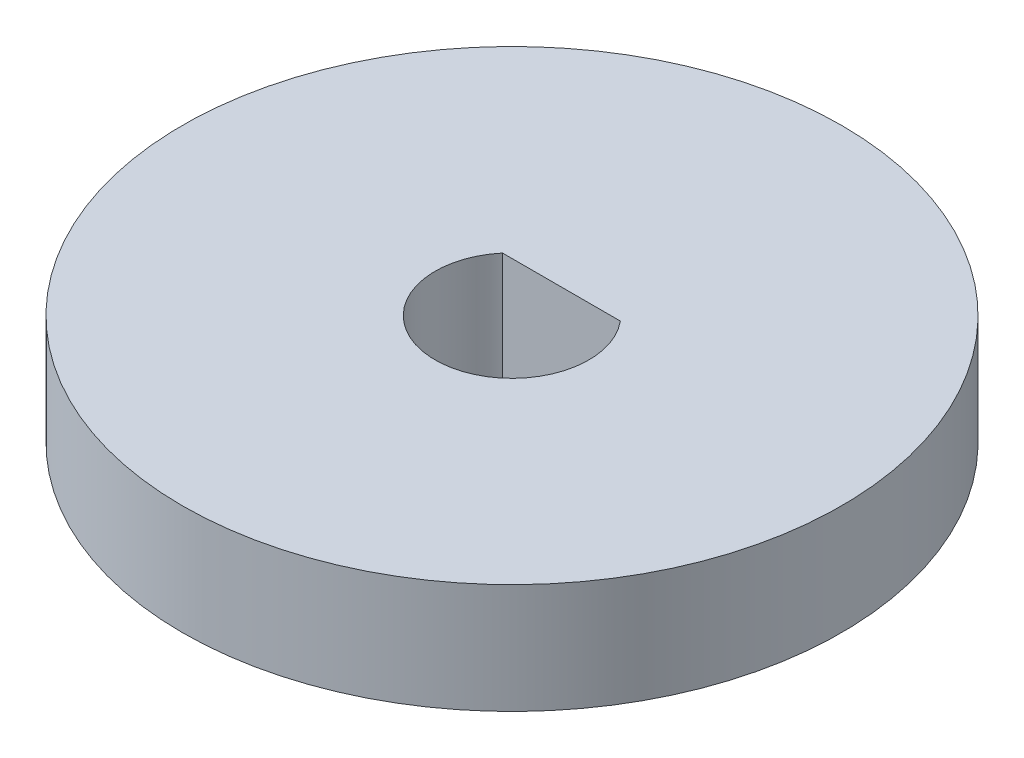
ISO-10303-21;
HEADER;
FILE_DESCRIPTION(('STEP AP214'),'2;1');
FILE_NAME('part.step','',(''),(''),'','','');
FILE_SCHEMA(('AUTOMOTIVE_DESIGN { 1 0 10303 214 1 1 1 1 }'));
ENDSEC;
DATA;
#1=APPLICATION_CONTEXT('core data for automotive mechanical design processes');
#2=APPLICATION_PROTOCOL_DEFINITION('international standard','automotive_design',2000,#1);
#3=PRODUCT_CONTEXT('',#1,'mechanical');
#4=PRODUCT('Part','Part','',(#3));
#5=PRODUCT_RELATED_PRODUCT_CATEGORY('part','',(#4));
#6=PRODUCT_DEFINITION_FORMATION('','',#4);
#7=PRODUCT_DEFINITION_CONTEXT('part definition',#1,'design');
#8=PRODUCT_DEFINITION('design','',#6,#7);
#9=PRODUCT_DEFINITION_SHAPE('','',#8);
#10=(LENGTH_UNIT() NAMED_UNIT(*) SI_UNIT(.MILLI.,.METRE.));
#11=(NAMED_UNIT(*) PLANE_ANGLE_UNIT() SI_UNIT($,.RADIAN.));
#12=(NAMED_UNIT(*) SI_UNIT($,.STERADIAN.) SOLID_ANGLE_UNIT());
#13=UNCERTAINTY_MEASURE_WITH_UNIT(LENGTH_MEASURE(1.E-05),#10,'distance_accuracy_value','');
#14=(GEOMETRIC_REPRESENTATION_CONTEXT(3) GLOBAL_UNCERTAINTY_ASSIGNED_CONTEXT((#13)) GLOBAL_UNIT_ASSIGNED_CONTEXT((#10,
#11,#12)) REPRESENTATION_CONTEXT('',''));
#15=CARTESIAN_POINT('',(0.,0.,0.));
#16=DIRECTION('',(0.,0.,1.));
#17=DIRECTION('',(1.,0.,0.));
#18=AXIS2_PLACEMENT_3D('',#15,#16,#17);
#19=CARTESIAN_POINT('',(0.,2.,0.));
#20=DIRECTION('',(0.,-1.,0.));
#21=DIRECTION('',(0.,0.,-0.999999999999997));
#22=AXIS2_PLACEMENT_3D('',#19,#20,#21);
#23=CYLINDRICAL_SURFACE('',#22,1.4);
#24=CARTESIAN_POINT('',(0.,0.,0.));
#25=DIRECTION('',(0.,1.,0.));
#26=DIRECTION('',(0.,0.,0.999999999999997));
#27=AXIS2_PLACEMENT_3D('',#24,#25,#26);
#28=CIRCLE('',#27,1.4);
#29=CARTESIAN_POINT('',(-1.07238052947637,0.,-0.899999999999999));
#30=VERTEX_POINT('',#29);
#31=CARTESIAN_POINT('',(1.07238052947635,0.,-0.900000000000001));
#32=VERTEX_POINT('',#31);
#33=EDGE_CURVE('E79',#30,#32,#28,.T.);
#34=ORIENTED_EDGE('',*,*,#33,.F.);
#35=DIRECTION('',(0.,-1.,0.));
#36=VECTOR('',#35,1.);
#37=CARTESIAN_POINT('',(-1.07238052947637,2.,-0.899999999999998));
#38=LINE('',#37,#36);
#39=CARTESIAN_POINT('',(-1.07238052947637,2.,-0.899999999999998));
#40=VERTEX_POINT('',#39);
#41=EDGE_CURVE('E13',#40,#30,#38,.T.);
#42=ORIENTED_EDGE('',*,*,#41,.F.);
#43=CARTESIAN_POINT('',(0.,2.,0.));
#44=DIRECTION('',(0.,1.,0.));
#45=DIRECTION('',(0.,0.,0.999999999999997));
#46=AXIS2_PLACEMENT_3D('',#43,#44,#45);
#47=CIRCLE('',#46,1.4);
#48=CARTESIAN_POINT('',(1.07238052947635,1.99999999999993,-0.899999999999998));
#49=VERTEX_POINT('',#48);
#50=EDGE_CURVE('E80',#40,#49,#47,.T.);
#51=ORIENTED_EDGE('',*,*,#50,.T.);
#52=DIRECTION('',(0.,-1.,0.));
#53=VECTOR('',#52,1.);
#54=CARTESIAN_POINT('',(1.07238052947635,1.99999999999993,-0.899999999999998));
#55=LINE('',#54,#53);
#56=EDGE_CURVE('E59',#49,#32,#55,.T.);
#57=ORIENTED_EDGE('',*,*,#56,.T.);
#58=EDGE_LOOP('',(#34,#42,#51,#57));
#59=FACE_BOUND('',#58,.T.);
#60=ADVANCED_FACE('F51',(#59),#23,.F.);
#61=CARTESIAN_POINT('',(0.,1.99999999999993,-0.899999999999998));
#62=DIRECTION('',(0.,0.,-0.999999999999997));
#63=DIRECTION('',(-0.999999999999997,0.,0.));
#64=AXIS2_PLACEMENT_3D('',#61,#62,#63);
#65=PLANE('',#64);
#66=DIRECTION('',(0.999999999999997,0.,0.));
#67=VECTOR('',#66,1.);
#68=CARTESIAN_POINT('',(0.,-1.04083408558608E-13,-0.900000000000001));
#69=LINE('',#68,#67);
#70=EDGE_CURVE('E82',#30,#32,#69,.T.);
#71=ORIENTED_EDGE('',*,*,#70,.T.);
#72=ORIENTED_EDGE('',*,*,#56,.F.);
#73=DIRECTION('',(0.999999999999997,0.,0.));
#74=VECTOR('',#73,1.);
#75=CARTESIAN_POINT('',(0.,1.99999999999993,-0.899999999999998));
#76=LINE('',#75,#74);
#77=EDGE_CURVE('E66',#40,#49,#76,.T.);
#78=ORIENTED_EDGE('',*,*,#77,.F.);
#79=ORIENTED_EDGE('',*,*,#41,.T.);
#80=EDGE_LOOP('',(#71,#72,#78,#79));
#81=FACE_BOUND('',#80,.T.);
#82=ADVANCED_FACE('F83',(#81),#65,.F.);
#83=CARTESIAN_POINT('',(0.,2.,0.));
#84=DIRECTION('',(0.,-1.,0.));
#85=DIRECTION('',(0.,0.,-0.999999999999997));
#86=AXIS2_PLACEMENT_3D('',#83,#84,#85);
#87=CYLINDRICAL_SURFACE('',#86,6.);
#88=CARTESIAN_POINT('',(0.,2.,0.));
#89=DIRECTION('',(0.,1.,0.));
#90=DIRECTION('',(0.,0.,0.999999999999997));
#91=AXIS2_PLACEMENT_3D('',#88,#89,#90);
#92=CIRCLE('',#91,6.);
#93=CARTESIAN_POINT('',(0.,2.,5.99999999999998));
#94=VERTEX_POINT('',#93);
#95=EDGE_CURVE('E81',#94,#94,#92,.T.);
#96=ORIENTED_EDGE('',*,*,#95,.F.);
#97=EDGE_LOOP('',(#96));
#98=FACE_BOUND('',#97,.T.);
#99=CARTESIAN_POINT('',(0.,0.,0.));
#100=DIRECTION('',(0.,1.,0.));
#101=DIRECTION('',(0.,0.,0.999999999999997));
#102=AXIS2_PLACEMENT_3D('',#99,#100,#101);
#103=CIRCLE('',#102,6.);
#104=CARTESIAN_POINT('',(0.,0.,5.99999999999998));
#105=VERTEX_POINT('',#104);
#106=EDGE_CURVE('E85',#105,#105,#103,.T.);
#107=ORIENTED_EDGE('',*,*,#106,.T.);
#108=EDGE_LOOP('',(#107));
#109=FACE_BOUND('',#108,.T.);
#110=ADVANCED_FACE('F102',(#98,#109),#87,.T.);
#111=CARTESIAN_POINT('',(0.,2.,0.));
#112=DIRECTION('',(0.,1.,0.));
#113=DIRECTION('',(0.,0.,0.999999999999997));
#114=AXIS2_PLACEMENT_3D('',#111,#112,#113);
#115=PLANE('',#114);
#116=ORIENTED_EDGE('',*,*,#50,.F.);
#117=ORIENTED_EDGE('',*,*,#77,.T.);
#118=EDGE_LOOP('',(#116,#117));
#119=FACE_BOUND('',#118,.T.);
#120=ORIENTED_EDGE('',*,*,#95,.T.);
#121=EDGE_LOOP('',(#120));
#122=FACE_BOUND('',#121,.T.);
#123=ADVANCED_FACE('F100',(#119,#122),#115,.T.);
#124=CARTESIAN_POINT('',(0.,0.,0.));
#125=DIRECTION('',(0.,1.,0.));
#126=DIRECTION('',(0.,0.,0.999999999999997));
#127=AXIS2_PLACEMENT_3D('',#124,#125,#126);
#128=PLANE('',#127);
#129=ORIENTED_EDGE('',*,*,#33,.T.);
#130=ORIENTED_EDGE('',*,*,#70,.F.);
#131=EDGE_LOOP('',(#129,#130));
#132=FACE_BOUND('',#131,.T.);
#133=ORIENTED_EDGE('',*,*,#106,.F.);
#134=EDGE_LOOP('',(#133));
#135=FACE_BOUND('',#134,.T.);
#136=ADVANCED_FACE('F87',(#132,#135),#128,.F.);
#137=CLOSED_SHELL('',(#60,#82,#110,#123,#136));
#138=MANIFOLD_SOLID_BREP('B2',#137);
#139=ADVANCED_BREP_SHAPE_REPRESENTATION('',(#18,#138),#14);
#140=SHAPE_DEFINITION_REPRESENTATION(#9,#139);
ENDSEC;
END-ISO-10303-21;
